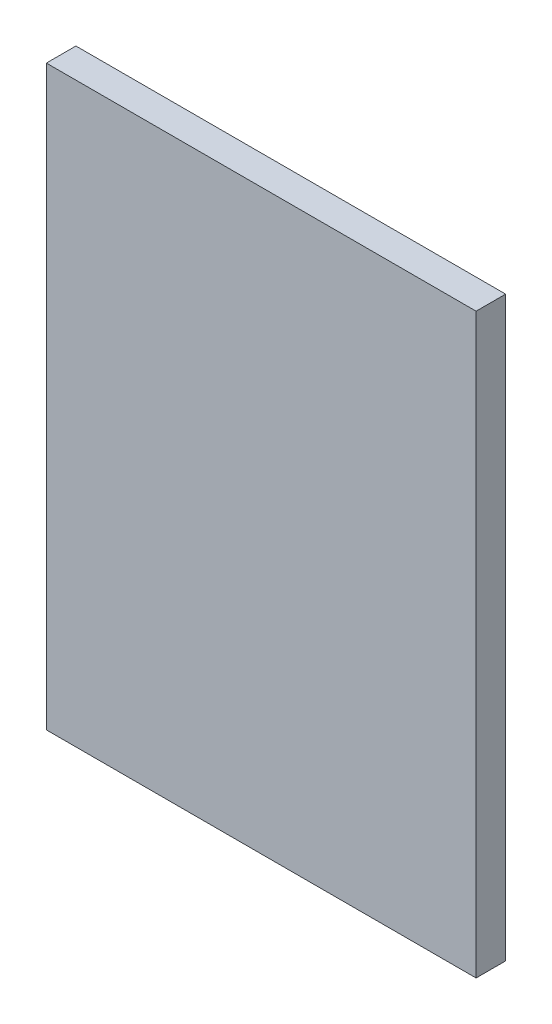
ISO-10303-21;
HEADER;
FILE_DESCRIPTION(('STEP AP214'),'2;1');
FILE_NAME('part.step','',(''),(''),'','','');
FILE_SCHEMA(('AUTOMOTIVE_DESIGN { 1 0 10303 214 1 1 1 1 }'));
ENDSEC;
DATA;
#1=APPLICATION_CONTEXT('core data for automotive mechanical design processes');
#2=APPLICATION_PROTOCOL_DEFINITION('international standard','automotive_design',2000,#1);
#3=PRODUCT_CONTEXT('',#1,'mechanical');
#4=PRODUCT('Part','Part','',(#3));
#5=PRODUCT_RELATED_PRODUCT_CATEGORY('part','',(#4));
#6=PRODUCT_DEFINITION_FORMATION('','',#4);
#7=PRODUCT_DEFINITION_CONTEXT('part definition',#1,'design');
#8=PRODUCT_DEFINITION('design','',#6,#7);
#9=PRODUCT_DEFINITION_SHAPE('','',#8);
#10=(LENGTH_UNIT() NAMED_UNIT(*) SI_UNIT(.MILLI.,.METRE.));
#11=(NAMED_UNIT(*) PLANE_ANGLE_UNIT() SI_UNIT($,.RADIAN.));
#12=(NAMED_UNIT(*) SI_UNIT($,.STERADIAN.) SOLID_ANGLE_UNIT());
#13=UNCERTAINTY_MEASURE_WITH_UNIT(LENGTH_MEASURE(1.E-05),#10,'distance_accuracy_value','');
#14=(GEOMETRIC_REPRESENTATION_CONTEXT(3) GLOBAL_UNCERTAINTY_ASSIGNED_CONTEXT((#13)) GLOBAL_UNIT_ASSIGNED_CONTEXT((#10,
#11,#12)) REPRESENTATION_CONTEXT('',''));
#15=CARTESIAN_POINT('',(0.,0.,0.));
#16=DIRECTION('',(0.,0.,1.));
#17=DIRECTION('',(1.,0.,0.));
#18=AXIS2_PLACEMENT_3D('',#15,#16,#17);
#19=CARTESIAN_POINT('',(17.45,-23.45,2.4));
#20=DIRECTION('',(-1.,0.,0.));
#21=DIRECTION('',(0.,0.,1.));
#22=AXIS2_PLACEMENT_3D('',#19,#20,#21);
#23=PLANE('',#22);
#24=DIRECTION('',(0.,1.,0.));
#25=VECTOR('',#24,1.);
#26=CARTESIAN_POINT('',(17.45,-23.45,0.));
#27=LINE('',#26,#25);
#28=CARTESIAN_POINT('',(17.45,-23.45,0.));
#29=VERTEX_POINT('',#28);
#30=CARTESIAN_POINT('',(17.45,23.45,0.));
#31=VERTEX_POINT('',#30);
#32=EDGE_CURVE('E102',#29,#31,#27,.T.);
#33=ORIENTED_EDGE('',*,*,#32,.T.);
#34=DIRECTION('',(0.,0.,-1.));
#35=VECTOR('',#34,1.);
#36=CARTESIAN_POINT('',(17.45,23.45,2.4));
#37=LINE('',#36,#35);
#38=CARTESIAN_POINT('',(17.45,23.45,2.4));
#39=VERTEX_POINT('',#38);
#40=EDGE_CURVE('E11',#39,#31,#37,.T.);
#41=ORIENTED_EDGE('',*,*,#40,.F.);
#42=DIRECTION('',(0.,1.,0.));
#43=VECTOR('',#42,1.);
#44=CARTESIAN_POINT('',(17.45,-23.45,2.4));
#45=LINE('',#44,#43);
#46=CARTESIAN_POINT('',(17.45,-23.45,2.4));
#47=VERTEX_POINT('',#46);
#48=EDGE_CURVE('E90',#47,#39,#45,.T.);
#49=ORIENTED_EDGE('',*,*,#48,.F.);
#50=DIRECTION('',(0.,0.,-1.));
#51=VECTOR('',#50,1.);
#52=CARTESIAN_POINT('',(17.45,-23.45,2.4));
#53=LINE('',#52,#51);
#54=EDGE_CURVE('E98',#47,#29,#53,.T.);
#55=ORIENTED_EDGE('',*,*,#54,.T.);
#56=EDGE_LOOP('',(#33,#41,#49,#55));
#57=FACE_BOUND('',#56,.T.);
#58=ADVANCED_FACE('F39',(#57),#23,.F.);
#59=CARTESIAN_POINT('',(-17.45,23.45,2.4));
#60=DIRECTION('',(0.,-1.,0.));
#61=DIRECTION('',(0.,0.,-1.));
#62=AXIS2_PLACEMENT_3D('',#59,#60,#61);
#63=PLANE('',#62);
#64=DIRECTION('',(-1.,0.,0.));
#65=VECTOR('',#64,1.);
#66=CARTESIAN_POINT('',(-17.45,23.45,0.));
#67=LINE('',#66,#65);
#68=CARTESIAN_POINT('',(-17.45,23.45,0.));
#69=VERTEX_POINT('',#68);
#70=EDGE_CURVE('E94',#31,#69,#67,.T.);
#71=ORIENTED_EDGE('',*,*,#70,.T.);
#72=DIRECTION('',(0.,0.,-1.));
#73=VECTOR('',#72,1.);
#74=CARTESIAN_POINT('',(-17.45,23.45,2.4));
#75=LINE('',#74,#73);
#76=CARTESIAN_POINT('',(-17.45,23.45,2.4));
#77=VERTEX_POINT('',#76);
#78=EDGE_CURVE('E47',#77,#69,#75,.T.);
#79=ORIENTED_EDGE('',*,*,#78,.F.);
#80=DIRECTION('',(-1.,0.,0.));
#81=VECTOR('',#80,1.);
#82=CARTESIAN_POINT('',(-17.45,23.45,2.4));
#83=LINE('',#82,#81);
#84=EDGE_CURVE('E85',#39,#77,#83,.T.);
#85=ORIENTED_EDGE('',*,*,#84,.F.);
#86=ORIENTED_EDGE('',*,*,#40,.T.);
#87=EDGE_LOOP('',(#71,#79,#85,#86));
#88=FACE_BOUND('',#87,.T.);
#89=ADVANCED_FACE('F93',(#88),#63,.F.);
#90=CARTESIAN_POINT('',(-17.45,-23.45,2.4));
#91=DIRECTION('',(1.,0.,0.));
#92=DIRECTION('',(0.,0.,-1.));
#93=AXIS2_PLACEMENT_3D('',#90,#91,#92);
#94=PLANE('',#93);
#95=DIRECTION('',(0.,-1.,0.));
#96=VECTOR('',#95,1.);
#97=CARTESIAN_POINT('',(-17.45,-23.45,0.));
#98=LINE('',#97,#96);
#99=CARTESIAN_POINT('',(-17.45,-23.45,0.));
#100=VERTEX_POINT('',#99);
#101=EDGE_CURVE('E72',#69,#100,#98,.T.);
#102=ORIENTED_EDGE('',*,*,#101,.T.);
#103=DIRECTION('',(0.,0.,-1.));
#104=VECTOR('',#103,1.);
#105=CARTESIAN_POINT('',(-17.45,-23.45,2.4));
#106=LINE('',#105,#104);
#107=CARTESIAN_POINT('',(-17.45,-23.45,2.4));
#108=VERTEX_POINT('',#107);
#109=EDGE_CURVE('E95',#108,#100,#106,.T.);
#110=ORIENTED_EDGE('',*,*,#109,.F.);
#111=DIRECTION('',(0.,-1.,0.));
#112=VECTOR('',#111,1.);
#113=CARTESIAN_POINT('',(-17.45,-23.45,2.4));
#114=LINE('',#113,#112);
#115=EDGE_CURVE('E88',#77,#108,#114,.T.);
#116=ORIENTED_EDGE('',*,*,#115,.F.);
#117=ORIENTED_EDGE('',*,*,#78,.T.);
#118=EDGE_LOOP('',(#102,#110,#116,#117));
#119=FACE_BOUND('',#118,.T.);
#120=ADVANCED_FACE('F96',(#119),#94,.F.);
#121=CARTESIAN_POINT('',(-17.45,-23.45,2.4));
#122=DIRECTION('',(0.,1.,0.));
#123=DIRECTION('',(0.,0.,1.));
#124=AXIS2_PLACEMENT_3D('',#121,#122,#123);
#125=PLANE('',#124);
#126=DIRECTION('',(1.,0.,0.));
#127=VECTOR('',#126,1.);
#128=CARTESIAN_POINT('',(-17.45,-23.45,0.));
#129=LINE('',#128,#127);
#130=EDGE_CURVE('E78',#100,#29,#129,.T.);
#131=ORIENTED_EDGE('',*,*,#130,.T.);
#132=ORIENTED_EDGE('',*,*,#54,.F.);
#133=DIRECTION('',(1.,0.,0.));
#134=VECTOR('',#133,1.);
#135=CARTESIAN_POINT('',(-17.45,-23.45,2.4));
#136=LINE('',#135,#134);
#137=EDGE_CURVE('E55',#108,#47,#136,.T.);
#138=ORIENTED_EDGE('',*,*,#137,.F.);
#139=ORIENTED_EDGE('',*,*,#109,.T.);
#140=EDGE_LOOP('',(#131,#132,#138,#139));
#141=FACE_BOUND('',#140,.T.);
#142=ADVANCED_FACE('F109',(#141),#125,.F.);
#143=CARTESIAN_POINT('',(0.,0.,2.4));
#144=DIRECTION('',(0.,0.,-1.));
#145=DIRECTION('',(-1.,0.,0.));
#146=AXIS2_PLACEMENT_3D('',#143,#144,#145);
#147=PLANE('',#146);
#148=ORIENTED_EDGE('',*,*,#48,.T.);
#149=ORIENTED_EDGE('',*,*,#84,.T.);
#150=ORIENTED_EDGE('',*,*,#115,.T.);
#151=ORIENTED_EDGE('',*,*,#137,.T.);
#152=EDGE_LOOP('',(#148,#149,#150,#151));
#153=FACE_BOUND('',#152,.T.);
#154=ADVANCED_FACE('F86',(#153),#147,.F.);
#155=CARTESIAN_POINT('',(0.,0.,0.));
#156=DIRECTION('',(0.,0.,-1.));
#157=DIRECTION('',(-1.,0.,0.));
#158=AXIS2_PLACEMENT_3D('',#155,#156,#157);
#159=PLANE('',#158);
#160=ORIENTED_EDGE('',*,*,#32,.F.);
#161=ORIENTED_EDGE('',*,*,#130,.F.);
#162=ORIENTED_EDGE('',*,*,#101,.F.);
#163=ORIENTED_EDGE('',*,*,#70,.F.);
#164=EDGE_LOOP('',(#160,#161,#162,#163));
#165=FACE_BOUND('',#164,.T.);
#166=ADVANCED_FACE('F112',(#165),#159,.T.);
#167=CLOSED_SHELL('',(#58,#89,#120,#142,#154,#166));
#168=MANIFOLD_SOLID_BREP('B2',#167);
#169=ADVANCED_BREP_SHAPE_REPRESENTATION('',(#18,#168),#14);
#170=SHAPE_DEFINITION_REPRESENTATION(#9,#169);
ENDSEC;
END-ISO-10303-21;
